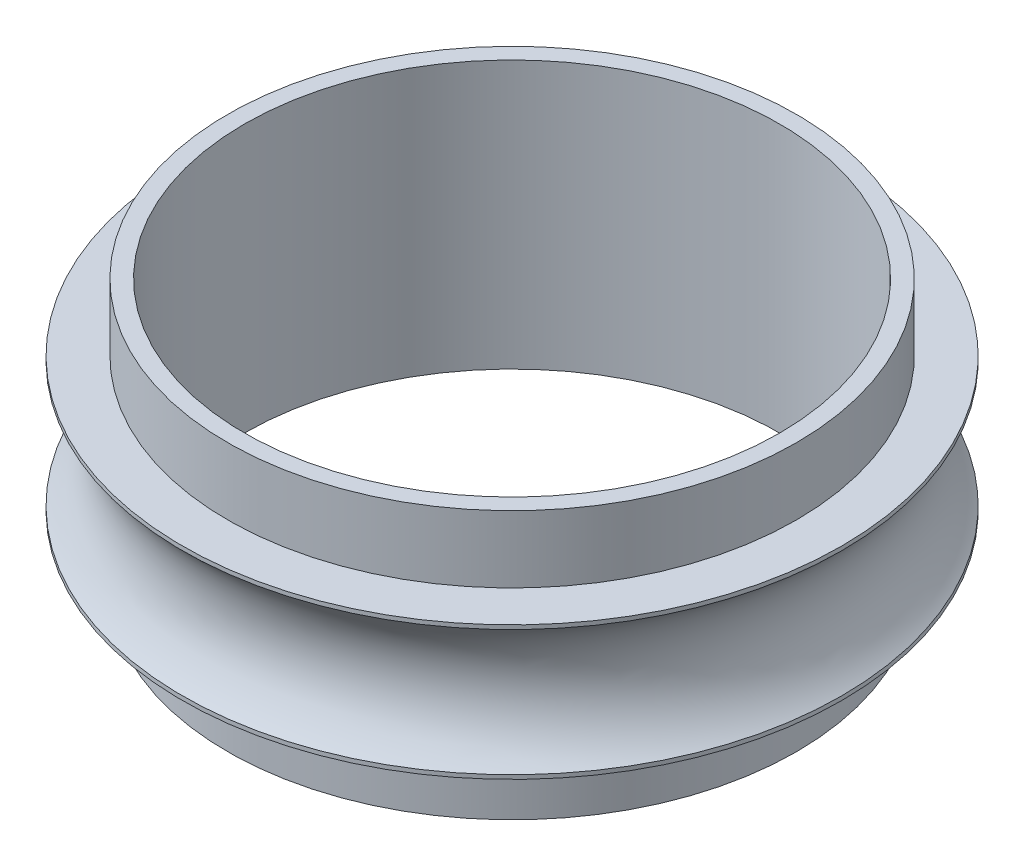
ISO-10303-21;
HEADER;
FILE_DESCRIPTION(('STEP AP214'),'2;1');
FILE_NAME('part.step','',(''),(''),'','','');
FILE_SCHEMA(('AUTOMOTIVE_DESIGN { 1 0 10303 214 1 1 1 1 }'));
ENDSEC;
DATA;
#1=APPLICATION_CONTEXT('core data for automotive mechanical design processes');
#2=APPLICATION_PROTOCOL_DEFINITION('international standard','automotive_design',2000,#1);
#3=PRODUCT_CONTEXT('',#1,'mechanical');
#4=PRODUCT('Part','Part','',(#3));
#5=PRODUCT_RELATED_PRODUCT_CATEGORY('part','',(#4));
#6=PRODUCT_DEFINITION_FORMATION('','',#4);
#7=PRODUCT_DEFINITION_CONTEXT('part definition',#1,'design');
#8=PRODUCT_DEFINITION('design','',#6,#7);
#9=PRODUCT_DEFINITION_SHAPE('','',#8);
#10=(LENGTH_UNIT() NAMED_UNIT(*) SI_UNIT(.MILLI.,.METRE.));
#11=(NAMED_UNIT(*) PLANE_ANGLE_UNIT() SI_UNIT($,.RADIAN.));
#12=(NAMED_UNIT(*) SI_UNIT($,.STERADIAN.) SOLID_ANGLE_UNIT());
#13=UNCERTAINTY_MEASURE_WITH_UNIT(LENGTH_MEASURE(1.E-05),#10,'distance_accuracy_value','');
#14=(GEOMETRIC_REPRESENTATION_CONTEXT(3) GLOBAL_UNCERTAINTY_ASSIGNED_CONTEXT((#13)) GLOBAL_UNIT_ASSIGNED_CONTEXT((#10,
#11,#12)) REPRESENTATION_CONTEXT('',''));
#15=CARTESIAN_POINT('',(0.,0.,0.));
#16=DIRECTION('',(0.,0.,1.));
#17=DIRECTION('',(1.,0.,0.));
#18=AXIS2_PLACEMENT_3D('',#15,#16,#17);
#19=CARTESIAN_POINT('',(11.5,4.4,0.));
#20=DIRECTION('',(0.,-1.,0.));
#21=DIRECTION('',(-1.,0.,0.));
#22=AXIS2_PLACEMENT_3D('',#19,#20,#21);
#23=CYLINDRICAL_SURFACE('',#22,8.5);
#24=CARTESIAN_POINT('',(11.5,2.,0.));
#25=DIRECTION('',(0.,-1.,0.));
#26=DIRECTION('',(-1.,0.,0.));
#27=AXIS2_PLACEMENT_3D('',#24,#25,#26);
#28=CIRCLE('',#27,8.5);
#29=CARTESIAN_POINT('',(20.,2.,0.));
#30=VERTEX_POINT('',#29);
#31=EDGE_CURVE('E28',#30,#30,#28,.T.);
#32=ORIENTED_EDGE('',*,*,#31,.F.);
#33=DIRECTION('',(0.,1.,0.));
#34=VECTOR('',#33,1.);
#35=CARTESIAN_POINT('',(20.,4.4,0.));
#36=LINE('',#35,#34);
#37=CARTESIAN_POINT('',(20.,4.,0.));
#38=VERTEX_POINT('',#37);
#39=EDGE_CURVE('E11',#30,#38,#36,.T.);
#40=ORIENTED_EDGE('',*,*,#39,.T.);
#41=CARTESIAN_POINT('',(11.5,4.,0.));
#42=DIRECTION('',(0.,1.,0.));
#43=DIRECTION('',(-1.,0.,0.));
#44=AXIS2_PLACEMENT_3D('',#41,#42,#43);
#45=CIRCLE('',#44,8.5);
#46=EDGE_CURVE('E106',#38,#38,#45,.T.);
#47=ORIENTED_EDGE('',*,*,#46,.F.);
#48=ORIENTED_EDGE('',*,*,#39,.F.);
#49=EDGE_LOOP('',(#32,#40,#47,#48));
#50=FACE_BOUND('',#49,.T.);
#51=ADVANCED_FACE('F17',(#50),#23,.T.);
#52=CARTESIAN_POINT('',(11.5,2.,0.));
#53=DIRECTION('',(0.,-1.,0.));
#54=DIRECTION('',(0.,0.,-1.));
#55=AXIS2_PLACEMENT_3D('',#52,#53,#54);
#56=PLANE('',#55);
#57=ORIENTED_EDGE('',*,*,#31,.T.);
#58=EDGE_LOOP('',(#57));
#59=FACE_BOUND('',#58,.T.);
#60=CARTESIAN_POINT('',(11.5,2.,0.));
#61=DIRECTION('',(0.,-1.,0.));
#62=DIRECTION('',(-1.,0.,0.));
#63=AXIS2_PLACEMENT_3D('',#60,#61,#62);
#64=CIRCLE('',#63,9.85);
#65=CARTESIAN_POINT('',(21.35,2.,0.));
#66=VERTEX_POINT('',#65);
#67=EDGE_CURVE('E102',#66,#66,#64,.T.);
#68=ORIENTED_EDGE('',*,*,#67,.F.);
#69=EDGE_LOOP('',(#68));
#70=FACE_BOUND('',#69,.T.);
#71=ADVANCED_FACE('F155',(#59,#70),#56,.F.);
#72=CARTESIAN_POINT('',(11.5,4.4,0.));
#73=DIRECTION('',(0.,-1.,0.));
#74=DIRECTION('',(-1.,0.,0.));
#75=AXIS2_PLACEMENT_3D('',#72,#73,#74);
#76=CYLINDRICAL_SURFACE('',#75,9.85);
#77=CARTESIAN_POINT('',(11.5,1.878163997099,0.));
#78=DIRECTION('',(0.,-1.,0.));
#79=DIRECTION('',(-1.,0.,0.));
#80=AXIS2_PLACEMENT_3D('',#77,#78,#79);
#81=CIRCLE('',#80,9.85);
#82=CARTESIAN_POINT('',(21.35,1.878163997099,0.));
#83=VERTEX_POINT('',#82);
#84=EDGE_CURVE('E21',#83,#83,#81,.T.);
#85=ORIENTED_EDGE('',*,*,#84,.F.);
#86=DIRECTION('',(0.,1.,0.));
#87=VECTOR('',#86,1.);
#88=CARTESIAN_POINT('',(21.35,4.4,0.));
#89=LINE('',#88,#87);
#90=EDGE_CURVE('E98',#83,#66,#89,.T.);
#91=ORIENTED_EDGE('',*,*,#90,.T.);
#92=ORIENTED_EDGE('',*,*,#67,.T.);
#93=ORIENTED_EDGE('',*,*,#90,.F.);
#94=EDGE_LOOP('',(#85,#91,#92,#93));
#95=FACE_BOUND('',#94,.T.);
#96=ADVANCED_FACE('F153',(#95),#76,.T.);
#97=CARTESIAN_POINT('',(11.5,0.,0.));
#98=DIRECTION('',(0.,-1.,0.));
#99=DIRECTION('',(-1.,0.,0.));
#100=AXIS2_PLACEMENT_3D('',#97,#98,#99);
#101=TOROIDAL_SURFACE('',#100,11.5,2.5);
#102=CARTESIAN_POINT('',(11.5,-1.878163997099,0.));
#103=DIRECTION('',(0.,-1.,0.));
#104=DIRECTION('',(-1.,0.,0.));
#105=AXIS2_PLACEMENT_3D('',#102,#103,#104);
#106=CIRCLE('',#105,9.85);
#107=CARTESIAN_POINT('',(21.35,-1.878163997099,0.));
#108=VERTEX_POINT('',#107);
#109=EDGE_CURVE('E92',#108,#108,#106,.T.);
#110=ORIENTED_EDGE('',*,*,#109,.F.);
#111=CARTESIAN_POINT('',(23.,0.,0.));
#112=DIRECTION('',(0.,0.,-1.));
#113=DIRECTION('',(1.,0.,0.));
#114=AXIS2_PLACEMENT_3D('',#111,#112,#113);
#115=CIRCLE('',#114,2.5);
#116=EDGE_CURVE('E96',#108,#83,#115,.T.);
#117=ORIENTED_EDGE('',*,*,#116,.T.);
#118=ORIENTED_EDGE('',*,*,#84,.T.);
#119=ORIENTED_EDGE('',*,*,#116,.F.);
#120=EDGE_LOOP('',(#110,#117,#118,#119));
#121=FACE_BOUND('',#120,.T.);
#122=ADVANCED_FACE('F152',(#121),#101,.F.);
#123=CARTESIAN_POINT('',(11.5,4.4,0.));
#124=DIRECTION('',(0.,-1.,0.));
#125=DIRECTION('',(-1.,0.,0.));
#126=AXIS2_PLACEMENT_3D('',#123,#124,#125);
#127=CYLINDRICAL_SURFACE('',#126,9.85);
#128=CARTESIAN_POINT('',(11.5,-2.,0.));
#129=DIRECTION('',(0.,-1.,0.));
#130=DIRECTION('',(-1.,0.,0.));
#131=AXIS2_PLACEMENT_3D('',#128,#129,#130);
#132=CIRCLE('',#131,9.85);
#133=CARTESIAN_POINT('',(21.35,-2.,0.));
#134=VERTEX_POINT('',#133);
#135=EDGE_CURVE('E109',#134,#134,#132,.T.);
#136=ORIENTED_EDGE('',*,*,#135,.F.);
#137=DIRECTION('',(0.,1.,0.));
#138=VECTOR('',#137,1.);
#139=CARTESIAN_POINT('',(21.35,4.4,0.));
#140=LINE('',#139,#138);
#141=EDGE_CURVE('E97',#134,#108,#140,.T.);
#142=ORIENTED_EDGE('',*,*,#141,.T.);
#143=ORIENTED_EDGE('',*,*,#109,.T.);
#144=ORIENTED_EDGE('',*,*,#141,.F.);
#145=EDGE_LOOP('',(#136,#142,#143,#144));
#146=FACE_BOUND('',#145,.T.);
#147=ADVANCED_FACE('F162',(#146),#127,.T.);
#148=CARTESIAN_POINT('',(11.5,-2.,0.));
#149=DIRECTION('',(0.,-1.,0.));
#150=DIRECTION('',(0.,0.,-1.));
#151=AXIS2_PLACEMENT_3D('',#148,#149,#150);
#152=PLANE('',#151);
#153=CARTESIAN_POINT('',(11.5,-2.,0.));
#154=DIRECTION('',(0.,-1.,0.));
#155=DIRECTION('',(-1.,0.,0.));
#156=AXIS2_PLACEMENT_3D('',#153,#154,#155);
#157=CIRCLE('',#156,8.5);
#158=CARTESIAN_POINT('',(20.,-2.,0.));
#159=VERTEX_POINT('',#158);
#160=EDGE_CURVE('E77',#159,#159,#157,.T.);
#161=ORIENTED_EDGE('',*,*,#160,.F.);
#162=EDGE_LOOP('',(#161));
#163=FACE_BOUND('',#162,.T.);
#164=ORIENTED_EDGE('',*,*,#135,.T.);
#165=EDGE_LOOP('',(#164));
#166=FACE_BOUND('',#165,.T.);
#167=ADVANCED_FACE('F175',(#163,#166),#152,.T.);
#168=CARTESIAN_POINT('',(11.5,4.4,0.));
#169=DIRECTION('',(0.,-1.,0.));
#170=DIRECTION('',(-1.,0.,0.));
#171=AXIS2_PLACEMENT_3D('',#168,#169,#170);
#172=CYLINDRICAL_SURFACE('',#171,8.5);
#173=CARTESIAN_POINT('',(11.5,-4.,0.));
#174=DIRECTION('',(0.,-1.,0.));
#175=DIRECTION('',(-1.,0.,0.));
#176=AXIS2_PLACEMENT_3D('',#173,#174,#175);
#177=CIRCLE('',#176,8.5);
#178=CARTESIAN_POINT('',(20.,-4.,0.));
#179=VERTEX_POINT('',#178);
#180=EDGE_CURVE('E75',#179,#179,#177,.T.);
#181=ORIENTED_EDGE('',*,*,#180,.F.);
#182=DIRECTION('',(0.,1.,0.));
#183=VECTOR('',#182,1.);
#184=CARTESIAN_POINT('',(20.,4.4,0.));
#185=LINE('',#184,#183);
#186=EDGE_CURVE('E72',#179,#159,#185,.T.);
#187=ORIENTED_EDGE('',*,*,#186,.T.);
#188=ORIENTED_EDGE('',*,*,#160,.T.);
#189=ORIENTED_EDGE('',*,*,#186,.F.);
#190=EDGE_LOOP('',(#181,#187,#188,#189));
#191=FACE_BOUND('',#190,.T.);
#192=ADVANCED_FACE('F74',(#191),#172,.T.);
#193=CARTESIAN_POINT('',(11.5,-4.,0.));
#194=DIRECTION('',(0.,-1.,0.));
#195=DIRECTION('',(0.,0.,-1.));
#196=AXIS2_PLACEMENT_3D('',#193,#194,#195);
#197=PLANE('',#196);
#198=CARTESIAN_POINT('',(11.5,-4.,0.));
#199=DIRECTION('',(0.,-1.,0.));
#200=DIRECTION('',(-1.,0.,0.));
#201=AXIS2_PLACEMENT_3D('',#198,#199,#200);
#202=CIRCLE('',#201,8.);
#203=CARTESIAN_POINT('',(19.5,-4.,0.));
#204=VERTEX_POINT('',#203);
#205=EDGE_CURVE('E82',#204,#204,#202,.T.);
#206=ORIENTED_EDGE('',*,*,#205,.F.);
#207=EDGE_LOOP('',(#206));
#208=FACE_BOUND('',#207,.T.);
#209=ORIENTED_EDGE('',*,*,#180,.T.);
#210=EDGE_LOOP('',(#209));
#211=FACE_BOUND('',#210,.T.);
#212=ADVANCED_FACE('F19',(#208,#211),#197,.T.);
#213=CARTESIAN_POINT('',(11.5,4.4,0.));
#214=DIRECTION('',(0.,-1.,0.));
#215=DIRECTION('',(-1.,0.,0.));
#216=AXIS2_PLACEMENT_3D('',#213,#214,#215);
#217=CYLINDRICAL_SURFACE('',#216,8.);
#218=CARTESIAN_POINT('',(11.5,4.,0.));
#219=DIRECTION('',(0.,-1.,0.));
#220=DIRECTION('',(-1.,0.,0.));
#221=AXIS2_PLACEMENT_3D('',#218,#219,#220);
#222=CIRCLE('',#221,8.);
#223=CARTESIAN_POINT('',(19.5,4.,0.));
#224=VERTEX_POINT('',#223);
#225=EDGE_CURVE('E103',#224,#224,#222,.T.);
#226=ORIENTED_EDGE('',*,*,#225,.F.);
#227=DIRECTION('',(0.,-1.,0.));
#228=VECTOR('',#227,1.);
#229=CARTESIAN_POINT('',(19.5,4.4,0.));
#230=LINE('',#229,#228);
#231=EDGE_CURVE('E88',#224,#204,#230,.T.);
#232=ORIENTED_EDGE('',*,*,#231,.T.);
#233=ORIENTED_EDGE('',*,*,#205,.T.);
#234=ORIENTED_EDGE('',*,*,#231,.F.);
#235=EDGE_LOOP('',(#226,#232,#233,#234));
#236=FACE_BOUND('',#235,.T.);
#237=ADVANCED_FACE('F173',(#236),#217,.F.);
#238=CARTESIAN_POINT('',(11.5,4.,0.));
#239=DIRECTION('',(0.,-1.,0.));
#240=DIRECTION('',(0.,0.,-1.));
#241=AXIS2_PLACEMENT_3D('',#238,#239,#240);
#242=PLANE('',#241);
#243=ORIENTED_EDGE('',*,*,#225,.T.);
#244=EDGE_LOOP('',(#243));
#245=FACE_BOUND('',#244,.T.);
#246=ORIENTED_EDGE('',*,*,#46,.T.);
#247=EDGE_LOOP('',(#246));
#248=FACE_BOUND('',#247,.T.);
#249=ADVANCED_FACE('F170',(#245,#248),#242,.F.);
#250=CLOSED_SHELL('',(#51,#71,#96,#122,#147,#167,#192,#212,#237,#249));
#251=MANIFOLD_SOLID_BREP('B1',#250);
#252=ADVANCED_BREP_SHAPE_REPRESENTATION('',(#18,#251),#14);
#253=SHAPE_DEFINITION_REPRESENTATION(#9,#252);
ENDSEC;
END-ISO-10303-21;
